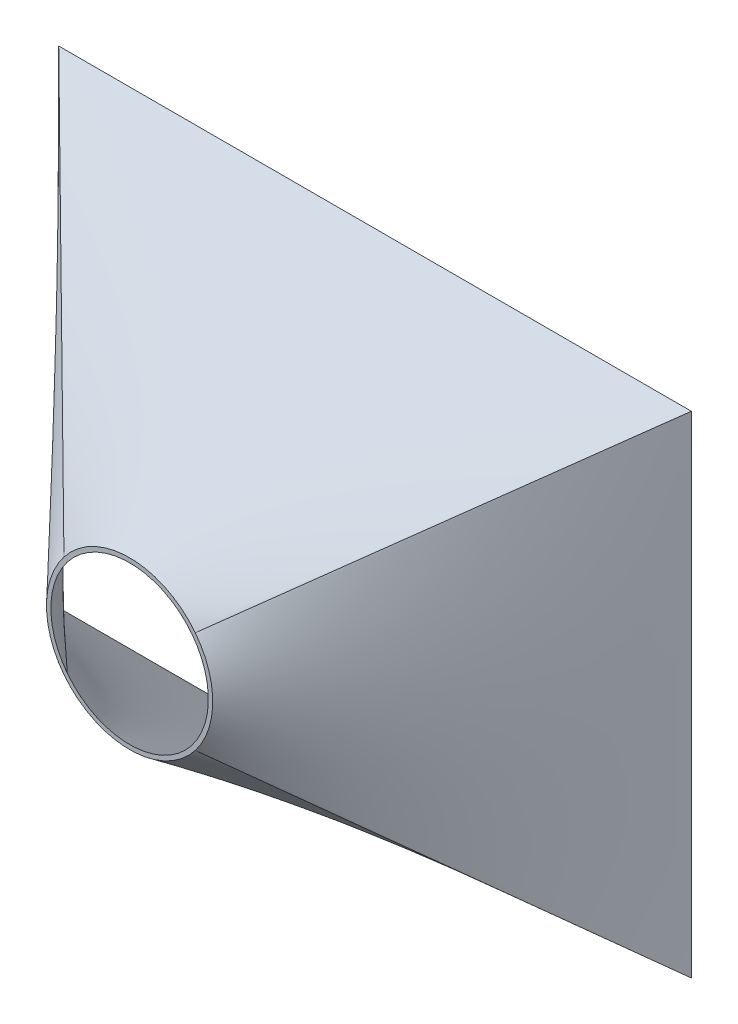
ISO-10303-21;
HEADER;
FILE_DESCRIPTION(('STEP AP214'),'2;1');
FILE_NAME('part.step','',(''),(''),'','','');
FILE_SCHEMA(('AUTOMOTIVE_DESIGN { 1 0 10303 214 1 1 1 1 }'));
ENDSEC;
DATA;
#1=APPLICATION_CONTEXT('core data for automotive mechanical design processes');
#2=APPLICATION_PROTOCOL_DEFINITION('international standard','automotive_design',2000,#1);
#3=PRODUCT_CONTEXT('',#1,'mechanical');
#4=PRODUCT('Part','Part','',(#3));
#5=PRODUCT_RELATED_PRODUCT_CATEGORY('part','',(#4));
#6=PRODUCT_DEFINITION_FORMATION('','',#4);
#7=PRODUCT_DEFINITION_CONTEXT('part definition',#1,'design');
#8=PRODUCT_DEFINITION('design','',#6,#7);
#9=PRODUCT_DEFINITION_SHAPE('','',#8);
#10=(LENGTH_UNIT() NAMED_UNIT(*) SI_UNIT(.MILLI.,.METRE.));
#11=(NAMED_UNIT(*) PLANE_ANGLE_UNIT() SI_UNIT($,.RADIAN.));
#12=(NAMED_UNIT(*) SI_UNIT($,.STERADIAN.) SOLID_ANGLE_UNIT());
#13=UNCERTAINTY_MEASURE_WITH_UNIT(LENGTH_MEASURE(1.E-05),#10,'distance_accuracy_value','');
#14=(GEOMETRIC_REPRESENTATION_CONTEXT(3) GLOBAL_UNCERTAINTY_ASSIGNED_CONTEXT((#13)) GLOBAL_UNIT_ASSIGNED_CONTEXT((#10,
#11,#12)) REPRESENTATION_CONTEXT('',''));
#15=CARTESIAN_POINT('',(0.,0.,0.));
#16=DIRECTION('',(0.,0.,1.));
#17=DIRECTION('',(1.,0.,0.));
#18=AXIS2_PLACEMENT_3D('',#15,#16,#17);
#19=CARTESIAN_POINT('',(290.,225.,225.));
#20=DIRECTION('',(0.,0.,1.));
#21=DIRECTION('',(1.,0.,0.));
#22=AXIS2_PLACEMENT_3D('',#19,#20,#21);
#23=PLANE('',#22);
#24=CARTESIAN_POINT('',(290.,225.,225.));
#25=DIRECTION('',(0.,0.,1.));
#26=DIRECTION('',(1.,0.,0.));
#27=AXIS2_PLACEMENT_3D('',#24,#25,#26);
#28=CIRCLE('',#27,72.2);
#29=CARTESIAN_POINT('',(347.130777100514,269.14650957767,225.));
#30=VERTEX_POINT('',#29);
#31=CARTESIAN_POINT('',(232.869222899485,269.14650957767,225.));
#32=VERTEX_POINT('',#31);
#33=EDGE_CURVE('E177',#30,#32,#28,.T.);
#34=ORIENTED_EDGE('',*,*,#33,.F.);
#35=CARTESIAN_POINT('',(347.130777100514,180.85349042233,225.));
#36=VERTEX_POINT('',#35);
#37=EDGE_CURVE('E440',#36,#30,#28,.T.);
#38=ORIENTED_EDGE('',*,*,#37,.F.);
#39=CARTESIAN_POINT('',(232.869222899485,180.85349042233,225.));
#40=VERTEX_POINT('',#39);
#41=EDGE_CURVE('E449',#40,#36,#28,.T.);
#42=ORIENTED_EDGE('',*,*,#41,.F.);
#43=EDGE_CURVE('E103',#32,#40,#28,.T.);
#44=ORIENTED_EDGE('',*,*,#43,.F.);
#45=EDGE_LOOP('',(#34,#38,#42,#44));
#46=FACE_BOUND('',#45,.T.);
#47=CARTESIAN_POINT('',(290.,225.,225.));
#48=DIRECTION('',(0.,0.,1.));
#49=DIRECTION('',(1.,0.,0.));
#50=AXIS2_PLACEMENT_3D('',#47,#48,#49);
#51=CIRCLE('',#50,76.2);
#52=CARTESIAN_POINT('',(350.204488797186,178.289620760804,225.));
#53=VERTEX_POINT('',#52);
#54=CARTESIAN_POINT('',(350.204488797186,271.710379239196,225.));
#55=VERTEX_POINT('',#54);
#56=EDGE_CURVE('E12',#53,#55,#51,.T.);
#57=ORIENTED_EDGE('',*,*,#56,.T.);
#58=CARTESIAN_POINT('',(229.795511202814,271.710379239196,225.));
#59=VERTEX_POINT('',#58);
#60=EDGE_CURVE('E110',#55,#59,#51,.T.);
#61=ORIENTED_EDGE('',*,*,#60,.T.);
#62=CARTESIAN_POINT('',(229.795511202814,178.289620760804,225.));
#63=VERTEX_POINT('',#62);
#64=EDGE_CURVE('E289',#59,#63,#51,.T.);
#65=ORIENTED_EDGE('',*,*,#64,.T.);
#66=EDGE_CURVE('E288',#63,#53,#51,.T.);
#67=ORIENTED_EDGE('',*,*,#66,.T.);
#68=EDGE_LOOP('',(#57,#61,#65,#67));
#69=FACE_BOUND('',#68,.T.);
#70=ADVANCED_FACE('F99',(#46,#69),#23,.T.);
#71=CARTESIAN_POINT('',(0.,0.,0.));
#72=DIRECTION('',(0.,0.,-1.));
#73=DIRECTION('',(-1.,0.,0.));
#74=AXIS2_PLACEMENT_3D('',#71,#72,#73);
#75=PLANE('',#74);
#76=DIRECTION('',(1.,0.,0.));
#77=VECTOR('',#76,1.);
#78=CARTESIAN_POINT('',(4.,446.,0.));
#79=LINE('',#78,#77);
#80=CARTESIAN_POINT('',(4.,446.,0.));
#81=VERTEX_POINT('',#80);
#82=CARTESIAN_POINT('',(576.,446.,0.));
#83=VERTEX_POINT('',#82);
#84=EDGE_CURVE('E174',#81,#83,#79,.T.);
#85=ORIENTED_EDGE('',*,*,#84,.F.);
#86=DIRECTION('',(0.,1.,0.));
#87=VECTOR('',#86,1.);
#88=CARTESIAN_POINT('',(4.,4.,0.));
#89=LINE('',#88,#87);
#90=CARTESIAN_POINT('',(4.,4.,0.));
#91=VERTEX_POINT('',#90);
#92=EDGE_CURVE('E185',#91,#81,#89,.T.);
#93=ORIENTED_EDGE('',*,*,#92,.F.);
#94=DIRECTION('',(-1.,0.,0.));
#95=VECTOR('',#94,1.);
#96=CARTESIAN_POINT('',(576.,4.,0.));
#97=LINE('',#96,#95);
#98=CARTESIAN_POINT('',(576.,4.,0.));
#99=VERTEX_POINT('',#98);
#100=EDGE_CURVE('E192',#99,#91,#97,.T.);
#101=ORIENTED_EDGE('',*,*,#100,.F.);
#102=DIRECTION('',(0.,-1.,0.));
#103=VECTOR('',#102,1.);
#104=CARTESIAN_POINT('',(576.,446.,0.));
#105=LINE('',#104,#103);
#106=EDGE_CURVE('E126',#83,#99,#105,.T.);
#107=ORIENTED_EDGE('',*,*,#106,.F.);
#108=EDGE_LOOP('',(#85,#93,#101,#107));
#109=FACE_BOUND('',#108,.T.);
#110=DIRECTION('',(1.,0.,0.));
#111=VECTOR('',#110,1.);
#112=CARTESIAN_POINT('',(580.,0.,0.));
#113=LINE('',#112,#111);
#114=CARTESIAN_POINT('',(0.,0.,0.));
#115=VERTEX_POINT('',#114);
#116=CARTESIAN_POINT('',(580.,0.,0.));
#117=VERTEX_POINT('',#116);
#118=EDGE_CURVE('E352',#115,#117,#113,.T.);
#119=ORIENTED_EDGE('',*,*,#118,.F.);
#120=DIRECTION('',(0.,-1.,0.));
#121=VECTOR('',#120,1.);
#122=CARTESIAN_POINT('',(0.,0.,0.));
#123=LINE('',#122,#121);
#124=CARTESIAN_POINT('',(0.,450.,0.));
#125=VERTEX_POINT('',#124);
#126=EDGE_CURVE('E336',#125,#115,#123,.T.);
#127=ORIENTED_EDGE('',*,*,#126,.F.);
#128=DIRECTION('',(-1.,0.,0.));
#129=VECTOR('',#128,1.);
#130=CARTESIAN_POINT('',(0.,450.,0.));
#131=LINE('',#130,#129);
#132=CARTESIAN_POINT('',(580.,450.,0.));
#133=VERTEX_POINT('',#132);
#134=EDGE_CURVE('E417',#133,#125,#131,.T.);
#135=ORIENTED_EDGE('',*,*,#134,.F.);
#136=DIRECTION('',(0.,1.,0.));
#137=VECTOR('',#136,1.);
#138=CARTESIAN_POINT('',(580.,450.,0.));
#139=LINE('',#138,#137);
#140=EDGE_CURVE('E411',#117,#133,#139,.T.);
#141=ORIENTED_EDGE('',*,*,#140,.F.);
#142=EDGE_LOOP('',(#119,#127,#135,#141));
#143=FACE_BOUND('',#142,.T.);
#144=ADVANCED_FACE('F197',(#109,#143),#75,.T.);
#145=CARTESIAN_POINT('',(580.,450.,0.));
#146=CARTESIAN_POINT('',(350.204488797186,271.710379239196,225.));
#147=CARTESIAN_POINT('',(567.916666666667,450.,0.));
#148=CARTESIAN_POINT('',(348.666773079984,273.692323941367,225.));
#149=CARTESIAN_POINT('',(555.833333333333,450.,0.));
#150=CARTESIAN_POINT('',(346.993635320936,275.646523017167,225.));
#151=CARTESIAN_POINT('',(531.666666666667,450.,0.));
#152=CARTESIAN_POINT('',(343.369393334896,279.452296699859,225.));
#153=CARTESIAN_POINT('',(519.583333333333,450.,0.));
#154=CARTESIAN_POINT('',(341.41820996355,281.303802353492,225.));
#155=CARTESIAN_POINT('',(495.416666666667,450.,0.));
#156=CARTESIAN_POINT('',(337.24067717085,284.852058408682,225.));
#157=CARTESIAN_POINT('',(483.333333333333,450.,0.));
#158=CARTESIAN_POINT('',(335.014266841261,286.548706578728,225.));
#159=CARTESIAN_POINT('',(459.166666666667,450.,0.));
#160=CARTESIAN_POINT('',(330.301327826671,289.732762000225,225.));
#161=CARTESIAN_POINT('',(447.083333333333,450.,0.));
#162=CARTESIAN_POINT('',(327.814771717876,291.220039222936,225.));
#163=CARTESIAN_POINT('',(422.916666666667,450.,0.));
#164=CARTESIAN_POINT('',(322.610220600763,293.93202497484,225.));
#165=CARTESIAN_POINT('',(410.833333333333,450.,0.));
#166=CARTESIAN_POINT('',(319.892244932687,295.156588890399,225.));
#167=CARTESIAN_POINT('',(386.666666666667,450.,0.));
#168=CARTESIAN_POINT('',(314.267334830365,297.29515704446,225.));
#169=CARTESIAN_POINT('',(374.583333333333,450.,0.));
#170=CARTESIAN_POINT('',(311.360473471158,298.209022080051,225.));
#171=CARTESIAN_POINT('',(350.416666666667,450.,0.));
#172=CARTESIAN_POINT('',(305.412705334016,299.687878903583,225.));
#173=CARTESIAN_POINT('',(338.333333333333,450.,0.));
#174=CARTESIAN_POINT('',(302.37192234927,300.252760058227,225.));
#175=CARTESIAN_POINT('',(314.166666666666,450.,0.));
#176=CARTESIAN_POINT('',(296.220681661667,301.008851317867,225.));
#177=CARTESIAN_POINT('',(302.083333333333,450.,0.));
#178=CARTESIAN_POINT('',(293.110384218392,301.2,225.));
#179=CARTESIAN_POINT('',(277.916666666666,450.,0.));
#180=CARTESIAN_POINT('',(286.889615781608,301.2,225.));
#181=CARTESIAN_POINT('',(265.833333333333,450.,0.));
#182=CARTESIAN_POINT('',(283.779318338333,301.008851317867,225.));
#183=CARTESIAN_POINT('',(241.666666666666,450.,0.));
#184=CARTESIAN_POINT('',(277.62807765073,300.252760058227,225.));
#185=CARTESIAN_POINT('',(229.583333333333,450.,0.));
#186=CARTESIAN_POINT('',(274.587294665984,299.687878903583,225.));
#187=CARTESIAN_POINT('',(205.416666666667,450.,0.));
#188=CARTESIAN_POINT('',(268.639526528842,298.209022080051,225.));
#189=CARTESIAN_POINT('',(193.333333333333,450.,0.));
#190=CARTESIAN_POINT('',(265.732665169635,297.29515704446,225.));
#191=CARTESIAN_POINT('',(169.166666666667,450.,0.));
#192=CARTESIAN_POINT('',(260.107755067313,295.156588890399,225.));
#193=CARTESIAN_POINT('',(157.083333333333,450.,0.));
#194=CARTESIAN_POINT('',(257.389779399237,293.93202497484,225.));
#195=CARTESIAN_POINT('',(132.916666666667,450.,0.));
#196=CARTESIAN_POINT('',(252.185228282124,291.220039222936,225.));
#197=CARTESIAN_POINT('',(120.833333333333,450.,0.));
#198=CARTESIAN_POINT('',(249.698672173329,289.732762000225,225.));
#199=CARTESIAN_POINT('',(96.6666666666666,450.,0.));
#200=CARTESIAN_POINT('',(244.985733158739,286.548706578728,225.));
#201=CARTESIAN_POINT('',(84.5833333333333,450.,0.));
#202=CARTESIAN_POINT('',(242.75932282915,284.852058408682,225.));
#203=CARTESIAN_POINT('',(60.4166666666666,450.,0.));
#204=CARTESIAN_POINT('',(238.58179003645,281.303802353492,225.));
#205=CARTESIAN_POINT('',(48.3333333333333,450.,0.));
#206=CARTESIAN_POINT('',(236.630606665104,279.45229669986,225.));
#207=CARTESIAN_POINT('',(24.1666666666666,450.,0.));
#208=CARTESIAN_POINT('',(233.006364679064,275.646523017167,225.));
#209=CARTESIAN_POINT('',(12.0833333333333,450.,0.));
#210=CARTESIAN_POINT('',(231.333226920016,273.692323941367,225.));
#211=CARTESIAN_POINT('',(0.,450.,0.));
#212=CARTESIAN_POINT('',(229.795511202814,271.710379239196,225.));
#213=B_SPLINE_SURFACE_WITH_KNOTS('',3,1,((#145,#146),(#147,#148),(#149,#150),(#151,#152),(#153,
#154),(#155,#156),(#157,#158),(#159,#160),(#161,#162),(#163,#164),(#165,#166),(#167,#168),(#169,
#170),(#171,#172),(#173,#174),(#175,#176),(#177,#178),(#179,#180),(#181,#182),(#183,#184),(#185,
#186),(#187,#188),(#189,#190),(#191,#192),(#193,#194),(#195,#196),(#197,#198),(#199,#200),(#201,
#202),(#203,#204),(#205,#206),(#207,#208),(#209,#210),(#211,#212)),.UNSPECIFIED.,.F.,.F.,.F.,(4,
2,2,2,2,2,2,2,2,2,2,2,2,2,2,2,4),(2,2),(0.,0.0625,0.125,0.1875,0.25,0.3125,0.375,0.4375,0.5,
0.5625,0.625,0.6875,0.75,0.8125,0.875,0.9375,1.),(0.,1.),.UNSPECIFIED.);
#214=DIRECTION('',(0.624919419464377,-0.484851273722361,0.611878224441849));
#215=VECTOR('',#214,1.);
#216=CARTESIAN_POINT('',(114.897755601407,360.855189619598,112.5));
#217=LINE('',#216,#215);
#218=EDGE_CURVE('E339',#125,#59,#217,.T.);
#219=DIRECTION('',(0.624919419464377,0.484851273722361,-0.611878224441849));
#220=VECTOR('',#219,1.);
#221=CARTESIAN_POINT('',(465.102244398593,360.855189619598,112.5));
#222=LINE('',#221,#220);
#223=EDGE_CURVE('E344',#55,#133,#222,.T.);
#224=ORIENTED_EDGE('',*,*,#134,.T.);
#225=ORIENTED_EDGE('',*,*,#218,.T.);
#226=ORIENTED_EDGE('',*,*,#60,.F.);
#227=ORIENTED_EDGE('',*,*,#223,.T.);
#228=EDGE_LOOP('',(#224,#225,#226,#227));
#229=FACE_BOUND('',#228,.T.);
#230=ADVANCED_FACE('F221',(#229),#213,.T.);
#231=CARTESIAN_POINT('',(0.,450.,0.));
#232=CARTESIAN_POINT('',(229.795511202814,271.710379239196,225.));
#233=CARTESIAN_POINT('',(0.,431.25,0.));
#234=CARTESIAN_POINT('',(227.409400607156,268.634947804793,225.));
#235=CARTESIAN_POINT('',(0.,412.5,0.));
#236=CARTESIAN_POINT('',(225.196503229157,265.293823163272,225.));
#237=CARTESIAN_POINT('',(0.,375.,0.));
#238=CARTESIAN_POINT('',(221.264523975226,258.143924246978,225.));
#239=CARTESIAN_POINT('',(0.,356.25,0.));
#240=CARTESIAN_POINT('',(219.546202540907,254.335202528515,225.));
#241=CARTESIAN_POINT('',(0.,318.75,0.));
#242=CARTESIAN_POINT('',(216.734913754155,246.366301064637,225.));
#243=CARTESIAN_POINT('',(0.,300.,0.));
#244=CARTESIAN_POINT('',(215.64266358493,242.206569009022,225.));
#245=CARTESIAN_POINT('',(0.,262.5,0.));
#246=CARTESIAN_POINT('',(214.174986749804,233.697520417549,225.));
#247=CARTESIAN_POINT('',(0.,243.75,0.));
#248=CARTESIAN_POINT('',(213.8,229.348990429632,225.));
#249=CARTESIAN_POINT('',(0.,206.25,0.));
#250=CARTESIAN_POINT('',(213.8,220.651009570368,225.));
#251=CARTESIAN_POINT('',(0.,187.5,0.));
#252=CARTESIAN_POINT('',(214.174986749804,216.302479582452,225.));
#253=CARTESIAN_POINT('',(0.,150.,0.));
#254=CARTESIAN_POINT('',(215.64266358493,207.793430990978,225.));
#255=CARTESIAN_POINT('',(0.,131.25,0.));
#256=CARTESIAN_POINT('',(216.734913754154,203.633698935363,225.));
#257=CARTESIAN_POINT('',(0.,93.75,0.));
#258=CARTESIAN_POINT('',(219.546202540907,195.664797471485,225.));
#259=CARTESIAN_POINT('',(0.,75.,0.));
#260=CARTESIAN_POINT('',(221.264523975226,191.856075753022,225.));
#261=CARTESIAN_POINT('',(0.,37.5,0.));
#262=CARTESIAN_POINT('',(225.196503229157,184.706176836728,225.));
#263=CARTESIAN_POINT('',(0.,18.75,0.));
#264=CARTESIAN_POINT('',(227.409400607156,181.365052195207,225.));
#265=CARTESIAN_POINT('',(0.,0.,0.));
#266=CARTESIAN_POINT('',(229.795511202814,178.289620760804,225.));
#267=B_SPLINE_SURFACE_WITH_KNOTS('',3,1,((#231,#232),(#233,#234),(#235,#236),(#237,#238),(#239,
#240),(#241,#242),(#243,#244),(#245,#246),(#247,#248),(#249,#250),(#251,#252),(#253,#254),(#255,
#256),(#257,#258),(#259,#260),(#261,#262),(#263,#264),(#265,#266)),.UNSPECIFIED.,.F.,.F.,.F.,(4,
2,2,2,2,2,2,2,4),(2,2),(0.,0.125,0.25,0.375,0.5,0.625,0.75,0.875,1.),(0.,1.),.UNSPECIFIED.);
#268=DIRECTION('',(0.624919419464377,0.484851273722362,0.611878224441849));
#269=VECTOR('',#268,1.);
#270=CARTESIAN_POINT('',(114.897755601407,89.144810380402,112.5));
#271=LINE('',#270,#269);
#272=EDGE_CURVE('E326',#115,#63,#271,.T.);
#273=ORIENTED_EDGE('',*,*,#126,.T.);
#274=ORIENTED_EDGE('',*,*,#272,.T.);
#275=ORIENTED_EDGE('',*,*,#64,.F.);
#276=ORIENTED_EDGE('',*,*,#218,.F.);
#277=EDGE_LOOP('',(#273,#274,#275,#276));
#278=FACE_BOUND('',#277,.T.);
#279=ADVANCED_FACE('F334',(#278),#267,.T.);
#280=CARTESIAN_POINT('',(580.,0.,0.));
#281=CARTESIAN_POINT('',(350.204488797186,178.289620760804,225.));
#282=CARTESIAN_POINT('',(580.,18.75,0.));
#283=CARTESIAN_POINT('',(352.590599392844,181.365052195207,225.));
#284=CARTESIAN_POINT('',(580.,37.5,0.));
#285=CARTESIAN_POINT('',(354.803496770843,184.706176836728,225.));
#286=CARTESIAN_POINT('',(580.,75.,0.));
#287=CARTESIAN_POINT('',(358.735476024773,191.856075753022,225.));
#288=CARTESIAN_POINT('',(580.,93.75,0.));
#289=CARTESIAN_POINT('',(360.453797459093,195.664797471485,225.));
#290=CARTESIAN_POINT('',(580.,131.25,0.));
#291=CARTESIAN_POINT('',(363.265086245845,203.633698935363,225.));
#292=CARTESIAN_POINT('',(580.,150.,0.));
#293=CARTESIAN_POINT('',(364.35733641507,207.793430990978,225.));
#294=CARTESIAN_POINT('',(580.,187.5,0.));
#295=CARTESIAN_POINT('',(365.825013250196,216.302479582451,225.));
#296=CARTESIAN_POINT('',(580.,206.25,0.));
#297=CARTESIAN_POINT('',(366.2,220.651009570368,225.));
#298=CARTESIAN_POINT('',(580.,243.75,0.));
#299=CARTESIAN_POINT('',(366.2,229.348990429632,225.));
#300=CARTESIAN_POINT('',(580.,262.5,0.));
#301=CARTESIAN_POINT('',(365.825013250196,233.697520417549,225.));
#302=CARTESIAN_POINT('',(580.,300.,0.));
#303=CARTESIAN_POINT('',(364.35733641507,242.206569009022,225.));
#304=CARTESIAN_POINT('',(580.,318.75,0.));
#305=CARTESIAN_POINT('',(363.265086245845,246.366301064637,225.));
#306=CARTESIAN_POINT('',(580.,356.25,0.));
#307=CARTESIAN_POINT('',(360.453797459093,254.335202528515,225.));
#308=CARTESIAN_POINT('',(580.,375.,0.));
#309=CARTESIAN_POINT('',(358.735476024773,258.143924246978,225.));
#310=CARTESIAN_POINT('',(580.,412.5,0.));
#311=CARTESIAN_POINT('',(354.803496770843,265.293823163272,225.));
#312=CARTESIAN_POINT('',(580.,431.25,0.));
#313=CARTESIAN_POINT('',(352.590599392844,268.634947804793,225.));
#314=CARTESIAN_POINT('',(580.,450.,0.));
#315=CARTESIAN_POINT('',(350.204488797186,271.710379239196,225.));
#316=B_SPLINE_SURFACE_WITH_KNOTS('',3,1,((#280,#281),(#282,#283),(#284,#285),(#286,#287),(#288,
#289),(#290,#291),(#292,#293),(#294,#295),(#296,#297),(#298,#299),(#300,#301),(#302,#303),(#304,
#305),(#306,#307),(#308,#309),(#310,#311),(#312,#313),(#314,#315)),.UNSPECIFIED.,.F.,.F.,.F.,(4,
2,2,2,2,2,2,2,4),(2,2),(0.,0.125,0.25,0.375,0.5,0.625,0.75,0.875,1.),(0.,1.),.UNSPECIFIED.);
#317=DIRECTION('',(-0.624919419464377,0.484851273722362,0.611878224441849));
#318=VECTOR('',#317,1.);
#319=CARTESIAN_POINT('',(465.102244398593,89.144810380402,112.5));
#320=LINE('',#319,#318);
#321=EDGE_CURVE('E329',#117,#53,#320,.T.);
#322=ORIENTED_EDGE('',*,*,#140,.T.);
#323=ORIENTED_EDGE('',*,*,#223,.F.);
#324=ORIENTED_EDGE('',*,*,#56,.F.);
#325=ORIENTED_EDGE('',*,*,#321,.F.);
#326=EDGE_LOOP('',(#322,#323,#324,#325));
#327=FACE_BOUND('',#326,.T.);
#328=ADVANCED_FACE('F365',(#327),#316,.T.);
#329=CARTESIAN_POINT('',(0.,0.,0.));
#330=CARTESIAN_POINT('',(229.795511202814,178.289620760804,225.));
#331=CARTESIAN_POINT('',(12.0833333333333,0.,0.));
#332=CARTESIAN_POINT('',(231.333226920016,176.307676058633,225.));
#333=CARTESIAN_POINT('',(24.1666666666666,0.,0.));
#334=CARTESIAN_POINT('',(233.006364679064,174.353476982833,225.));
#335=CARTESIAN_POINT('',(48.3333333333332,0.,0.));
#336=CARTESIAN_POINT('',(236.630606665104,170.547703300141,225.));
#337=CARTESIAN_POINT('',(60.4166666666665,0.,0.));
#338=CARTESIAN_POINT('',(238.58179003645,168.696197646508,225.));
#339=CARTESIAN_POINT('',(84.5833333333332,0.,0.));
#340=CARTESIAN_POINT('',(242.75932282915,165.147941591318,225.));
#341=CARTESIAN_POINT('',(96.6666666666665,0.,0.));
#342=CARTESIAN_POINT('',(244.985733158739,163.451293421272,225.));
#343=CARTESIAN_POINT('',(120.833333333333,0.,0.));
#344=CARTESIAN_POINT('',(249.698672173329,160.267237999775,225.));
#345=CARTESIAN_POINT('',(132.916666666666,0.,0.));
#346=CARTESIAN_POINT('',(252.185228282124,158.779960777064,225.));
#347=CARTESIAN_POINT('',(157.083333333333,0.,0.));
#348=CARTESIAN_POINT('',(257.389779399237,156.067975025161,225.));
#349=CARTESIAN_POINT('',(169.166666666666,0.,0.));
#350=CARTESIAN_POINT('',(260.107755067313,154.843411109601,225.));
#351=CARTESIAN_POINT('',(193.333333333333,0.,0.));
#352=CARTESIAN_POINT('',(265.732665169635,152.70484295554,225.));
#353=CARTESIAN_POINT('',(205.416666666666,0.,0.));
#354=CARTESIAN_POINT('',(268.639526528842,151.790977919949,225.));
#355=CARTESIAN_POINT('',(229.583333333333,0.,0.));
#356=CARTESIAN_POINT('',(274.587294665984,150.312121096417,225.));
#357=CARTESIAN_POINT('',(241.666666666666,0.,0.));
#358=CARTESIAN_POINT('',(277.62807765073,149.747239941773,225.));
#359=CARTESIAN_POINT('',(265.833333333333,0.,0.));
#360=CARTESIAN_POINT('',(283.779318338333,148.991148682133,225.));
#361=CARTESIAN_POINT('',(277.916666666666,0.,0.));
#362=CARTESIAN_POINT('',(286.889615781608,148.8,225.));
#363=CARTESIAN_POINT('',(302.083333333333,0.,0.));
#364=CARTESIAN_POINT('',(293.110384218392,148.8,225.));
#365=CARTESIAN_POINT('',(314.166666666666,0.,0.));
#366=CARTESIAN_POINT('',(296.220681661667,148.991148682133,225.));
#367=CARTESIAN_POINT('',(338.333333333333,0.,0.));
#368=CARTESIAN_POINT('',(302.37192234927,149.747239941773,225.));
#369=CARTESIAN_POINT('',(350.416666666666,0.,0.));
#370=CARTESIAN_POINT('',(305.412705334016,150.312121096417,225.));
#371=CARTESIAN_POINT('',(374.583333333333,0.,0.));
#372=CARTESIAN_POINT('',(311.360473471158,151.790977919949,225.));
#373=CARTESIAN_POINT('',(386.666666666666,0.,0.));
#374=CARTESIAN_POINT('',(314.267334830365,152.70484295554,225.));
#375=CARTESIAN_POINT('',(410.833333333333,0.,0.));
#376=CARTESIAN_POINT('',(319.892244932687,154.843411109601,225.));
#377=CARTESIAN_POINT('',(422.916666666666,0.,0.));
#378=CARTESIAN_POINT('',(322.610220600763,156.067975025161,225.));
#379=CARTESIAN_POINT('',(447.083333333333,0.,0.));
#380=CARTESIAN_POINT('',(327.814771717876,158.779960777064,225.));
#381=CARTESIAN_POINT('',(459.166666666666,0.,0.));
#382=CARTESIAN_POINT('',(330.301327826671,160.267237999775,225.));
#383=CARTESIAN_POINT('',(483.333333333333,0.,0.));
#384=CARTESIAN_POINT('',(335.014266841261,163.451293421272,225.));
#385=CARTESIAN_POINT('',(495.416666666667,0.,0.));
#386=CARTESIAN_POINT('',(337.24067717085,165.147941591318,225.));
#387=CARTESIAN_POINT('',(519.583333333333,0.,0.));
#388=CARTESIAN_POINT('',(341.41820996355,168.696197646508,225.));
#389=CARTESIAN_POINT('',(531.666666666667,0.,0.));
#390=CARTESIAN_POINT('',(343.369393334896,170.547703300141,225.));
#391=CARTESIAN_POINT('',(555.833333333333,0.,0.));
#392=CARTESIAN_POINT('',(346.993635320936,174.353476982833,225.));
#393=CARTESIAN_POINT('',(567.916666666667,0.,0.));
#394=CARTESIAN_POINT('',(348.666773079984,176.307676058633,225.));
#395=CARTESIAN_POINT('',(580.,0.,0.));
#396=CARTESIAN_POINT('',(350.204488797186,178.289620760804,225.));
#397=B_SPLINE_SURFACE_WITH_KNOTS('',3,1,((#329,#330),(#331,#332),(#333,#334),(#335,#336),(#337,
#338),(#339,#340),(#341,#342),(#343,#344),(#345,#346),(#347,#348),(#349,#350),(#351,#352),(#353,
#354),(#355,#356),(#357,#358),(#359,#360),(#361,#362),(#363,#364),(#365,#366),(#367,#368),(#369,
#370),(#371,#372),(#373,#374),(#375,#376),(#377,#378),(#379,#380),(#381,#382),(#383,#384),(#385,
#386),(#387,#388),(#389,#390),(#391,#392),(#393,#394),(#395,#396)),.UNSPECIFIED.,.F.,.F.,.F.,(4,
2,2,2,2,2,2,2,2,2,2,2,2,2,2,2,4),(2,2),(0.,0.0625,0.125,0.1875,0.25,0.3125,0.375,0.4375,0.5,
0.5625,0.625,0.6875,0.75,0.8125,0.875,0.9375,1.),(0.,1.),.UNSPECIFIED.);
#398=ORIENTED_EDGE('',*,*,#118,.T.);
#399=ORIENTED_EDGE('',*,*,#321,.T.);
#400=ORIENTED_EDGE('',*,*,#66,.F.);
#401=ORIENTED_EDGE('',*,*,#272,.F.);
#402=EDGE_LOOP('',(#398,#399,#400,#401));
#403=FACE_BOUND('',#402,.T.);
#404=ADVANCED_FACE('F325',(#403),#397,.T.);
#405=CARTESIAN_POINT('',(576.,446.,0.));
#406=CARTESIAN_POINT('',(347.130777100514,269.14650957767,225.));
#407=CARTESIAN_POINT('',(564.083333333333,446.,0.));
#408=CARTESIAN_POINT('',(345.675257479988,271.030123204233,225.));
#409=CARTESIAN_POINT('',(552.166666666667,446.,0.));
#410=CARTESIAN_POINT('',(344.090894702852,272.88773534356,225.));
#411=CARTESIAN_POINT('',(528.333333333333,446.,0.));
#412=CARTESIAN_POINT('',(340.657527063152,276.506067971996,225.));
#413=CARTESIAN_POINT('',(516.416666666667,446.,0.));
#414=CARTESIAN_POINT('',(338.808446099007,278.266722873326,225.));
#415=CARTESIAN_POINT('',(492.583333333333,446.,0.));
#416=CARTESIAN_POINT('',(334.848141695445,281.641436799649,225.));
#417=CARTESIAN_POINT('',(480.666666666667,446.,0.));
#418=CARTESIAN_POINT('',(332.736859461337,283.255398207419,225.));
#419=CARTESIAN_POINT('',(456.833333333334,446.,0.));
#420=CARTESIAN_POINT('',(328.266345603384,286.28472379872,225.));
#421=CARTESIAN_POINT('',(444.916666666667,446.,0.));
#422=CARTESIAN_POINT('',(325.907087189658,287.699963514445,225.));
#423=CARTESIAN_POINT('',(421.083333333334,446.,0.));
#424=CARTESIAN_POINT('',(320.967848707729,290.280905949394,225.));
#425=CARTESIAN_POINT('',(409.166666666667,446.,0.));
#426=CARTESIAN_POINT('',(318.387886703121,291.446469995522,225.));
#427=CARTESIAN_POINT('',(385.333333333334,446.,0.));
#428=CARTESIAN_POINT('',(313.047680490806,293.482186810358,225.));
#429=CARTESIAN_POINT('',(373.416666666667,446.,0.));
#430=CARTESIAN_POINT('',(310.287505998477,294.352205923984,225.));
#431=CARTESIAN_POINT('',(349.583333333334,446.,0.));
#432=CARTESIAN_POINT('',(304.639227704739,295.760189219431,225.));
#433=CARTESIAN_POINT('',(337.666666666667,446.,0.));
#434=CARTESIAN_POINT('',(301.751242441288,296.298047083668,225.));
#435=CARTESIAN_POINT('',(313.833333333334,446.,0.));
#436=CARTESIAN_POINT('',(295.908763417122,297.017982002687,225.));
#437=CARTESIAN_POINT('',(301.916666666667,446.,0.));
#438=CARTESIAN_POINT('',(292.954423329666,297.2,225.));
#439=CARTESIAN_POINT('',(278.083333333334,446.,0.));
#440=CARTESIAN_POINT('',(287.045576670334,297.2,225.));
#441=CARTESIAN_POINT('',(266.166666666667,446.,0.));
#442=CARTESIAN_POINT('',(284.091236582878,297.017982002687,225.));
#443=CARTESIAN_POINT('',(242.333333333334,446.,0.));
#444=CARTESIAN_POINT('',(278.248757558712,296.298047083668,225.));
#445=CARTESIAN_POINT('',(230.416666666667,446.,0.));
#446=CARTESIAN_POINT('',(275.36077229526,295.760189219431,225.));
#447=CARTESIAN_POINT('',(206.583333333334,446.,0.));
#448=CARTESIAN_POINT('',(269.712494001523,294.352205923984,225.));
#449=CARTESIAN_POINT('',(194.666666666667,446.,0.));
#450=CARTESIAN_POINT('',(266.952319509194,293.482186810358,225.));
#451=CARTESIAN_POINT('',(170.833333333334,446.,0.));
#452=CARTESIAN_POINT('',(261.612113296879,291.446469995522,225.));
#453=CARTESIAN_POINT('',(158.916666666667,446.,0.));
#454=CARTESIAN_POINT('',(259.032151292271,290.280905949394,225.));
#455=CARTESIAN_POINT('',(135.083333333334,446.,0.));
#456=CARTESIAN_POINT('',(254.092912810342,287.699963514445,225.));
#457=CARTESIAN_POINT('',(123.166666666667,446.,0.));
#458=CARTESIAN_POINT('',(251.733654396616,286.28472379872,225.));
#459=CARTESIAN_POINT('',(99.3333333333336,446.,0.));
#460=CARTESIAN_POINT('',(247.263140538663,283.255398207419,225.));
#461=CARTESIAN_POINT('',(87.4166666666669,446.,0.));
#462=CARTESIAN_POINT('',(245.151858304555,281.641436799649,225.));
#463=CARTESIAN_POINT('',(63.5833333333335,446.,0.));
#464=CARTESIAN_POINT('',(241.191553900993,278.266722873326,225.));
#465=CARTESIAN_POINT('',(51.6666666666668,446.,0.));
#466=CARTESIAN_POINT('',(239.342472936848,276.506067971996,225.));
#467=CARTESIAN_POINT('',(27.8333333333334,446.,0.));
#468=CARTESIAN_POINT('',(235.909105297148,272.88773534356,225.));
#469=CARTESIAN_POINT('',(15.9166666666667,446.,0.));
#470=CARTESIAN_POINT('',(234.324742520012,271.030123204233,225.));
#471=CARTESIAN_POINT('',(4.,446.,0.));
#472=CARTESIAN_POINT('',(232.869222899485,269.14650957767,225.));
#473=B_SPLINE_SURFACE_WITH_KNOTS('',3,1,((#405,#406),(#407,#408),(#409,#410),(#411,#412),(#413,
#414),(#415,#416),(#417,#418),(#419,#420),(#421,#422),(#423,#424),(#425,#426),(#427,#428),(#429,
#430),(#431,#432),(#433,#434),(#435,#436),(#437,#438),(#439,#440),(#441,#442),(#443,#444),(#445,
#446),(#447,#448),(#449,#450),(#451,#452),(#453,#454),(#455,#456),(#457,#458),(#459,#460),(#461,
#462),(#463,#464),(#465,#466),(#467,#468),(#469,#470),(#471,#472)),.UNSPECIFIED.,.F.,.F.,.F.,(4,
2,2,2,2,2,2,2,2,2,2,2,2,2,2,2,4),(2,2),(0.,0.0625,0.125,0.1875,0.25,0.3125,0.375,0.4375,0.5,
0.5625,0.625,0.6875,0.75,0.8125,0.875,0.9375,1.),(0.,1.),.UNSPECIFIED.);
#474=DIRECTION('',(0.624563251674631,0.482617058112215,-0.614004494997164));
#475=VECTOR('',#474,1.);
#476=CARTESIAN_POINT('',(461.565388550257,357.573254788835,112.5));
#477=LINE('',#476,#475);
#478=EDGE_CURVE('E182',#30,#83,#477,.T.);
#479=DIRECTION('',(0.624563251674631,-0.482617058112215,0.614004494997164));
#480=VECTOR('',#479,1.);
#481=CARTESIAN_POINT('',(118.434611449743,357.573254788835,112.5));
#482=LINE('',#481,#480);
#483=EDGE_CURVE('E169',#81,#32,#482,.T.);
#484=ORIENTED_EDGE('',*,*,#84,.T.);
#485=ORIENTED_EDGE('',*,*,#478,.F.);
#486=ORIENTED_EDGE('',*,*,#33,.T.);
#487=ORIENTED_EDGE('',*,*,#483,.F.);
#488=EDGE_LOOP('',(#484,#485,#486,#487));
#489=FACE_BOUND('',#488,.T.);
#490=ADVANCED_FACE('F171',(#489),#473,.F.);
#491=CARTESIAN_POINT('',(4.,446.,0.));
#492=CARTESIAN_POINT('',(232.869222899485,269.14650957767,225.));
#493=CARTESIAN_POINT('',(4.,427.583333333333,0.));
#494=CARTESIAN_POINT('',(230.619783485945,266.235470336618,225.));
#495=CARTESIAN_POINT('',(4.,409.166666666667,0.));
#496=CARTESIAN_POINT('',(228.534318820421,263.074533519482,225.));
#497=CARTESIAN_POINT('',(4.,372.333333333333,0.));
#498=CARTESIAN_POINT('',(224.829593325619,256.313226590239,225.));
#499=CARTESIAN_POINT('',(4.,353.916666666667,0.));
#500=CARTESIAN_POINT('',(223.21104223234,252.7129087855,225.));
#501=CARTESIAN_POINT('',(4.,317.083333333333,0.));
#502=CARTESIAN_POINT('',(220.563364718136,245.182266319154,225.));
#503=CARTESIAN_POINT('',(4.,298.666666666666,0.));
#504=CARTESIAN_POINT('',(219.5349061421,241.252361475176,225.));
#505=CARTESIAN_POINT('',(4.,261.833333333333,0.));
#506=CARTESIAN_POINT('',(218.153019223339,233.214624714529,225.));
#507=CARTESIAN_POINT('',(4.,243.416666666666,0.));
#508=CARTESIAN_POINT('',(217.8,229.107527049331,225.));
#509=CARTESIAN_POINT('',(4.,206.583333333333,0.));
#510=CARTESIAN_POINT('',(217.8,220.89247295067,225.));
#511=CARTESIAN_POINT('',(4.,188.166666666666,0.));
#512=CARTESIAN_POINT('',(218.153019223339,216.785375285471,225.));
#513=CARTESIAN_POINT('',(4.,151.333333333333,0.));
#514=CARTESIAN_POINT('',(219.5349061421,208.747638524824,225.));
#515=CARTESIAN_POINT('',(4.,132.916666666667,0.));
#516=CARTESIAN_POINT('',(220.563364718136,204.817733680846,225.));
#517=CARTESIAN_POINT('',(4.,96.0833333333332,0.));
#518=CARTESIAN_POINT('',(223.211042232339,197.2870912145,225.));
#519=CARTESIAN_POINT('',(4.,77.6666666666666,0.));
#520=CARTESIAN_POINT('',(224.829593325619,193.686773409761,225.));
#521=CARTESIAN_POINT('',(4.,40.8333333333333,0.));
#522=CARTESIAN_POINT('',(228.534318820421,186.925466480518,225.));
#523=CARTESIAN_POINT('',(4.,22.4166666666666,0.));
#524=CARTESIAN_POINT('',(230.619783485945,183.764529663382,225.));
#525=CARTESIAN_POINT('',(4.,4.,0.));
#526=CARTESIAN_POINT('',(232.869222899485,180.85349042233,225.));
#527=B_SPLINE_SURFACE_WITH_KNOTS('',3,1,((#491,#492),(#493,#494),(#495,#496),(#497,#498),(#499,
#500),(#501,#502),(#503,#504),(#505,#506),(#507,#508),(#509,#510),(#511,#512),(#513,#514),(#515,
#516),(#517,#518),(#519,#520),(#521,#522),(#523,#524),(#525,#526)),.UNSPECIFIED.,.F.,.F.,.F.,(4,
2,2,2,2,2,2,2,4),(2,2),(0.,0.125,0.25,0.375,0.5,0.625,0.75,0.875,1.),(0.,1.),.UNSPECIFIED.);
#528=DIRECTION('',(0.624563251674631,0.482617058112215,0.614004494997164));
#529=VECTOR('',#528,1.);
#530=CARTESIAN_POINT('',(118.434611449743,92.4267452111649,112.5));
#531=LINE('',#530,#529);
#532=EDGE_CURVE('E118',#91,#40,#531,.T.);
#533=ORIENTED_EDGE('',*,*,#92,.T.);
#534=ORIENTED_EDGE('',*,*,#483,.T.);
#535=ORIENTED_EDGE('',*,*,#43,.T.);
#536=ORIENTED_EDGE('',*,*,#532,.F.);
#537=EDGE_LOOP('',(#533,#534,#535,#536));
#538=FACE_BOUND('',#537,.T.);
#539=ADVANCED_FACE('F187',(#538),#527,.F.);
#540=CARTESIAN_POINT('',(576.,4.,0.));
#541=CARTESIAN_POINT('',(347.130777100514,180.85349042233,225.));
#542=CARTESIAN_POINT('',(576.,22.4166666666667,0.));
#543=CARTESIAN_POINT('',(349.380216514055,183.764529663382,225.));
#544=CARTESIAN_POINT('',(576.,40.8333333333333,0.));
#545=CARTESIAN_POINT('',(351.465681179579,186.925466480518,225.));
#546=CARTESIAN_POINT('',(576.,77.6666666666667,0.));
#547=CARTESIAN_POINT('',(355.17040667438,193.686773409761,225.));
#548=CARTESIAN_POINT('',(576.,96.0833333333334,0.));
#549=CARTESIAN_POINT('',(356.788957767661,197.2870912145,225.));
#550=CARTESIAN_POINT('',(576.,132.916666666667,0.));
#551=CARTESIAN_POINT('',(359.436635281863,204.817733680846,225.));
#552=CARTESIAN_POINT('',(576.,151.333333333333,0.));
#553=CARTESIAN_POINT('',(360.4650938579,208.747638524824,225.));
#554=CARTESIAN_POINT('',(576.,188.166666666667,0.));
#555=CARTESIAN_POINT('',(361.846980776661,216.785375285471,225.));
#556=CARTESIAN_POINT('',(576.,206.583333333333,0.));
#557=CARTESIAN_POINT('',(362.2,220.89247295067,225.));
#558=CARTESIAN_POINT('',(576.,243.416666666667,0.));
#559=CARTESIAN_POINT('',(362.2,229.107527049331,225.));
#560=CARTESIAN_POINT('',(576.,261.833333333333,0.));
#561=CARTESIAN_POINT('',(361.846980776661,233.214624714529,225.));
#562=CARTESIAN_POINT('',(576.,298.666666666667,0.));
#563=CARTESIAN_POINT('',(360.4650938579,241.252361475176,225.));
#564=CARTESIAN_POINT('',(576.,317.083333333333,0.));
#565=CARTESIAN_POINT('',(359.436635281863,245.182266319154,225.));
#566=CARTESIAN_POINT('',(576.,353.916666666667,0.));
#567=CARTESIAN_POINT('',(356.78895776766,252.7129087855,225.));
#568=CARTESIAN_POINT('',(576.,372.333333333333,0.));
#569=CARTESIAN_POINT('',(355.170406674381,256.313226590239,225.));
#570=CARTESIAN_POINT('',(576.,409.166666666667,0.));
#571=CARTESIAN_POINT('',(351.465681179579,263.074533519482,225.));
#572=CARTESIAN_POINT('',(576.,427.583333333333,0.));
#573=CARTESIAN_POINT('',(349.380216514055,266.235470336618,225.));
#574=CARTESIAN_POINT('',(576.,446.,0.));
#575=CARTESIAN_POINT('',(347.130777100514,269.14650957767,225.));
#576=B_SPLINE_SURFACE_WITH_KNOTS('',3,1,((#540,#541),(#542,#543),(#544,#545),(#546,#547),(#548,
#549),(#550,#551),(#552,#553),(#554,#555),(#556,#557),(#558,#559),(#560,#561),(#562,#563),(#564,
#565),(#566,#567),(#568,#569),(#570,#571),(#572,#573),(#574,#575)),.UNSPECIFIED.,.F.,.F.,.F.,(4,
2,2,2,2,2,2,2,4),(2,2),(0.,0.125,0.25,0.375,0.5,0.625,0.75,0.875,1.),(0.,1.),.UNSPECIFIED.);
#577=DIRECTION('',(-0.624563251674631,0.482617058112215,0.614004494997164));
#578=VECTOR('',#577,1.);
#579=CARTESIAN_POINT('',(461.565388550257,92.4267452111649,112.5));
#580=LINE('',#579,#578);
#581=EDGE_CURVE('E509',#99,#36,#580,.T.);
#582=ORIENTED_EDGE('',*,*,#106,.T.);
#583=ORIENTED_EDGE('',*,*,#581,.T.);
#584=ORIENTED_EDGE('',*,*,#37,.T.);
#585=ORIENTED_EDGE('',*,*,#478,.T.);
#586=EDGE_LOOP('',(#582,#583,#584,#585));
#587=FACE_BOUND('',#586,.T.);
#588=ADVANCED_FACE('F525',(#587),#576,.F.);
#589=CARTESIAN_POINT('',(4.,4.,0.));
#590=CARTESIAN_POINT('',(232.869222899485,180.85349042233,225.));
#591=CARTESIAN_POINT('',(15.9166666666667,4.,0.));
#592=CARTESIAN_POINT('',(234.324742520012,178.969876795767,225.));
#593=CARTESIAN_POINT('',(27.8333333333334,4.,0.));
#594=CARTESIAN_POINT('',(235.909105297148,177.11226465644,225.));
#595=CARTESIAN_POINT('',(51.6666666666668,4.,0.));
#596=CARTESIAN_POINT('',(239.342472936848,173.493932028004,225.));
#597=CARTESIAN_POINT('',(63.5833333333335,4.,0.));
#598=CARTESIAN_POINT('',(241.191553900993,171.733277126674,225.));
#599=CARTESIAN_POINT('',(87.4166666666669,4.,0.));
#600=CARTESIAN_POINT('',(245.151858304555,168.358563200351,225.));
#601=CARTESIAN_POINT('',(99.3333333333337,4.,0.));
#602=CARTESIAN_POINT('',(247.263140538663,166.744601792581,225.));
#603=CARTESIAN_POINT('',(123.166666666667,4.,0.));
#604=CARTESIAN_POINT('',(251.733654396615,163.71527620128,225.));
#605=CARTESIAN_POINT('',(135.083333333334,4.,0.));
#606=CARTESIAN_POINT('',(254.092912810342,162.300036485555,225.));
#607=CARTESIAN_POINT('',(158.916666666667,4.,0.));
#608=CARTESIAN_POINT('',(259.032151292271,159.719094050606,225.));
#609=CARTESIAN_POINT('',(170.833333333334,4.,0.));
#610=CARTESIAN_POINT('',(261.612113296879,158.553530004478,225.));
#611=CARTESIAN_POINT('',(194.666666666667,4.,0.));
#612=CARTESIAN_POINT('',(266.952319509194,156.517813189642,225.));
#613=CARTESIAN_POINT('',(206.583333333334,4.,0.));
#614=CARTESIAN_POINT('',(269.712494001523,155.647794076016,225.));
#615=CARTESIAN_POINT('',(230.416666666667,4.,0.));
#616=CARTESIAN_POINT('',(275.36077229526,154.239810780569,225.));
#617=CARTESIAN_POINT('',(242.333333333334,4.,0.));
#618=CARTESIAN_POINT('',(278.248757558711,153.701952916332,225.));
#619=CARTESIAN_POINT('',(266.166666666667,4.,0.));
#620=CARTESIAN_POINT('',(284.091236582878,152.982017997313,225.));
#621=CARTESIAN_POINT('',(278.083333333334,4.,0.));
#622=CARTESIAN_POINT('',(287.045576670334,152.8,225.));
#623=CARTESIAN_POINT('',(301.916666666667,4.,0.));
#624=CARTESIAN_POINT('',(292.954423329665,152.8,225.));
#625=CARTESIAN_POINT('',(313.833333333334,4.,0.));
#626=CARTESIAN_POINT('',(295.908763417121,152.982017997313,225.));
#627=CARTESIAN_POINT('',(337.666666666667,4.,0.));
#628=CARTESIAN_POINT('',(301.751242441288,153.701952916332,225.));
#629=CARTESIAN_POINT('',(349.583333333334,4.,0.));
#630=CARTESIAN_POINT('',(304.639227704739,154.239810780569,225.));
#631=CARTESIAN_POINT('',(373.416666666667,4.,0.));
#632=CARTESIAN_POINT('',(310.287505998477,155.647794076016,225.));
#633=CARTESIAN_POINT('',(385.333333333334,4.,0.));
#634=CARTESIAN_POINT('',(313.047680490805,156.517813189642,225.));
#635=CARTESIAN_POINT('',(409.166666666667,4.,0.));
#636=CARTESIAN_POINT('',(318.387886703121,158.553530004478,225.));
#637=CARTESIAN_POINT('',(421.083333333334,4.,0.));
#638=CARTESIAN_POINT('',(320.967848707729,159.719094050606,225.));
#639=CARTESIAN_POINT('',(444.916666666667,4.,0.));
#640=CARTESIAN_POINT('',(325.907087189658,162.300036485555,225.));
#641=CARTESIAN_POINT('',(456.833333333334,4.,0.));
#642=CARTESIAN_POINT('',(328.266345603384,163.71527620128,225.));
#643=CARTESIAN_POINT('',(480.666666666667,4.,0.));
#644=CARTESIAN_POINT('',(332.736859461337,166.744601792581,225.));
#645=CARTESIAN_POINT('',(492.583333333334,4.,0.));
#646=CARTESIAN_POINT('',(334.848141695445,168.358563200351,225.));
#647=CARTESIAN_POINT('',(516.416666666667,4.,0.));
#648=CARTESIAN_POINT('',(338.808446099007,171.733277126674,225.));
#649=CARTESIAN_POINT('',(528.333333333334,4.,0.));
#650=CARTESIAN_POINT('',(340.657527063152,173.493932028004,225.));
#651=CARTESIAN_POINT('',(552.166666666667,4.,0.));
#652=CARTESIAN_POINT('',(344.090894702852,177.11226465644,225.));
#653=CARTESIAN_POINT('',(564.083333333333,4.,0.));
#654=CARTESIAN_POINT('',(345.675257479988,178.969876795767,225.));
#655=CARTESIAN_POINT('',(576.,4.,0.));
#656=CARTESIAN_POINT('',(347.130777100514,180.85349042233,225.));
#657=B_SPLINE_SURFACE_WITH_KNOTS('',3,1,((#589,#590),(#591,#592),(#593,#594),(#595,#596),(#597,
#598),(#599,#600),(#601,#602),(#603,#604),(#605,#606),(#607,#608),(#609,#610),(#611,#612),(#613,
#614),(#615,#616),(#617,#618),(#619,#620),(#621,#622),(#623,#624),(#625,#626),(#627,#628),(#629,
#630),(#631,#632),(#633,#634),(#635,#636),(#637,#638),(#639,#640),(#641,#642),(#643,#644),(#645,
#646),(#647,#648),(#649,#650),(#651,#652),(#653,#654),(#655,#656)),.UNSPECIFIED.,.F.,.F.,.F.,(4,
2,2,2,2,2,2,2,2,2,2,2,2,2,2,2,4),(2,2),(0.,0.0625,0.125,0.1875,0.25,0.3125,0.375,0.4375,0.5,
0.5625,0.625,0.6875,0.75,0.8125,0.875,0.9375,1.),(0.,1.),.UNSPECIFIED.);
#658=ORIENTED_EDGE('',*,*,#100,.T.);
#659=ORIENTED_EDGE('',*,*,#532,.T.);
#660=ORIENTED_EDGE('',*,*,#41,.T.);
#661=ORIENTED_EDGE('',*,*,#581,.F.);
#662=EDGE_LOOP('',(#658,#659,#660,#661));
#663=FACE_BOUND('',#662,.T.);
#664=ADVANCED_FACE('F222',(#663),#657,.F.);
#665=CLOSED_SHELL('',(#70,#144,#230,#279,#328,#404,#490,#539,#588,#664));
#666=MANIFOLD_SOLID_BREP('B2',#665);
#667=ADVANCED_BREP_SHAPE_REPRESENTATION('',(#18,#666),#14);
#668=SHAPE_DEFINITION_REPRESENTATION(#9,#667);
ENDSEC;
END-ISO-10303-21;
